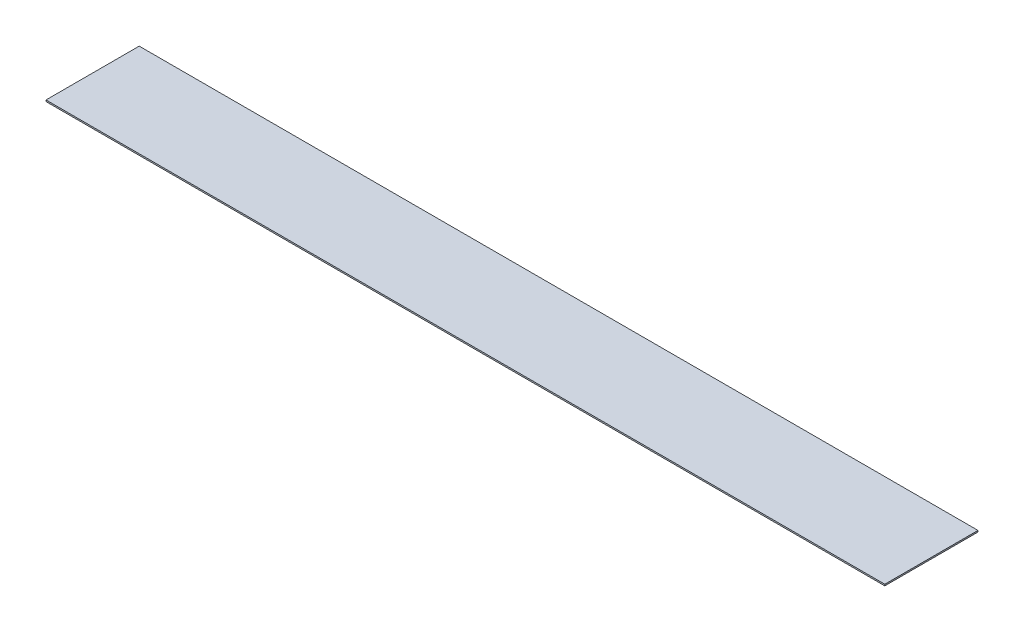
ISO-10303-21;
HEADER;
FILE_DESCRIPTION(('STEP AP214'),'2;1');
FILE_NAME('part.step','',(''),(''),'','','');
FILE_SCHEMA(('AUTOMOTIVE_DESIGN { 1 0 10303 214 1 1 1 1 }'));
ENDSEC;
DATA;
#1=APPLICATION_CONTEXT('core data for automotive mechanical design processes');
#2=APPLICATION_PROTOCOL_DEFINITION('international standard','automotive_design',2000,#1);
#3=PRODUCT_CONTEXT('',#1,'mechanical');
#4=PRODUCT('Part','Part','',(#3));
#5=PRODUCT_RELATED_PRODUCT_CATEGORY('part','',(#4));
#6=PRODUCT_DEFINITION_FORMATION('','',#4);
#7=PRODUCT_DEFINITION_CONTEXT('part definition',#1,'design');
#8=PRODUCT_DEFINITION('design','',#6,#7);
#9=PRODUCT_DEFINITION_SHAPE('','',#8);
#10=(LENGTH_UNIT() NAMED_UNIT(*) SI_UNIT(.MILLI.,.METRE.));
#11=(NAMED_UNIT(*) PLANE_ANGLE_UNIT() SI_UNIT($,.RADIAN.));
#12=(NAMED_UNIT(*) SI_UNIT($,.STERADIAN.) SOLID_ANGLE_UNIT());
#13=UNCERTAINTY_MEASURE_WITH_UNIT(LENGTH_MEASURE(1.E-05),#10,'distance_accuracy_value','');
#14=(GEOMETRIC_REPRESENTATION_CONTEXT(3) GLOBAL_UNCERTAINTY_ASSIGNED_CONTEXT((#13)) GLOBAL_UNIT_ASSIGNED_CONTEXT((#10,
#11,#12)) REPRESENTATION_CONTEXT('',''));
#15=CARTESIAN_POINT('',(0.,0.,0.));
#16=DIRECTION('',(0.,0.,1.));
#17=DIRECTION('',(1.,0.,0.));
#18=AXIS2_PLACEMENT_3D('',#15,#16,#17);
#19=CARTESIAN_POINT('',(0.,1.5875,0.));
#20=DIRECTION('',(1.,0.,0.));
#21=DIRECTION('',(0.,0.,-1.));
#22=AXIS2_PLACEMENT_3D('',#19,#20,#21);
#23=PLANE('',#22);
#24=DIRECTION('',(0.,0.,1.));
#25=VECTOR('',#24,1.);
#26=CARTESIAN_POINT('',(0.,0.,0.));
#27=LINE('',#26,#25);
#28=CARTESIAN_POINT('',(0.,0.,-101.6));
#29=VERTEX_POINT('',#28);
#30=CARTESIAN_POINT('',(0.,0.,0.));
#31=VERTEX_POINT('',#30);
#32=EDGE_CURVE('E96',#29,#31,#27,.T.);
#33=ORIENTED_EDGE('',*,*,#32,.T.);
#34=DIRECTION('',(0.,-1.,0.));
#35=VECTOR('',#34,1.);
#36=CARTESIAN_POINT('',(0.,1.5875,0.));
#37=LINE('',#36,#35);
#38=CARTESIAN_POINT('',(0.,1.5875,0.));
#39=VERTEX_POINT('',#38);
#40=EDGE_CURVE('E11',#39,#31,#37,.T.);
#41=ORIENTED_EDGE('',*,*,#40,.F.);
#42=DIRECTION('',(0.,0.,1.));
#43=VECTOR('',#42,1.);
#44=CARTESIAN_POINT('',(0.,1.5875,0.));
#45=LINE('',#44,#43);
#46=CARTESIAN_POINT('',(0.,1.5875,-101.6));
#47=VERTEX_POINT('',#46);
#48=EDGE_CURVE('E84',#47,#39,#45,.T.);
#49=ORIENTED_EDGE('',*,*,#48,.F.);
#50=DIRECTION('',(0.,-1.,0.));
#51=VECTOR('',#50,1.);
#52=CARTESIAN_POINT('',(0.,1.5875,-101.6));
#53=LINE('',#52,#51);
#54=EDGE_CURVE('E92',#47,#29,#53,.T.);
#55=ORIENTED_EDGE('',*,*,#54,.T.);
#56=EDGE_LOOP('',(#33,#41,#49,#55));
#57=FACE_BOUND('',#56,.T.);
#58=ADVANCED_FACE('F33',(#57),#23,.F.);
#59=CARTESIAN_POINT('',(0.,1.5875,0.));
#60=DIRECTION('',(0.,0.,-1.));
#61=DIRECTION('',(-1.,0.,0.));
#62=AXIS2_PLACEMENT_3D('',#59,#60,#61);
#63=PLANE('',#62);
#64=DIRECTION('',(1.,0.,0.));
#65=VECTOR('',#64,1.);
#66=CARTESIAN_POINT('',(0.,0.,0.));
#67=LINE('',#66,#65);
#68=CARTESIAN_POINT('',(914.4,0.,0.));
#69=VERTEX_POINT('',#68);
#70=EDGE_CURVE('E88',#31,#69,#67,.T.);
#71=ORIENTED_EDGE('',*,*,#70,.T.);
#72=DIRECTION('',(0.,-1.,0.));
#73=VECTOR('',#72,1.);
#74=CARTESIAN_POINT('',(914.4,1.5875,0.));
#75=LINE('',#74,#73);
#76=CARTESIAN_POINT('',(914.4,1.5875,0.));
#77=VERTEX_POINT('',#76);
#78=EDGE_CURVE('E41',#77,#69,#75,.T.);
#79=ORIENTED_EDGE('',*,*,#78,.F.);
#80=DIRECTION('',(1.,0.,0.));
#81=VECTOR('',#80,1.);
#82=CARTESIAN_POINT('',(0.,1.5875,0.));
#83=LINE('',#82,#81);
#84=EDGE_CURVE('E79',#39,#77,#83,.T.);
#85=ORIENTED_EDGE('',*,*,#84,.F.);
#86=ORIENTED_EDGE('',*,*,#40,.T.);
#87=EDGE_LOOP('',(#71,#79,#85,#86));
#88=FACE_BOUND('',#87,.T.);
#89=ADVANCED_FACE('F87',(#88),#63,.F.);
#90=CARTESIAN_POINT('',(914.4,1.5875,0.));
#91=DIRECTION('',(-1.,0.,0.));
#92=DIRECTION('',(0.,0.,1.));
#93=AXIS2_PLACEMENT_3D('',#90,#91,#92);
#94=PLANE('',#93);
#95=DIRECTION('',(0.,0.,-1.));
#96=VECTOR('',#95,1.);
#97=CARTESIAN_POINT('',(914.4,0.,0.));
#98=LINE('',#97,#96);
#99=CARTESIAN_POINT('',(914.4,0.,-101.6));
#100=VERTEX_POINT('',#99);
#101=EDGE_CURVE('E66',#69,#100,#98,.T.);
#102=ORIENTED_EDGE('',*,*,#101,.T.);
#103=DIRECTION('',(0.,-1.,0.));
#104=VECTOR('',#103,1.);
#105=CARTESIAN_POINT('',(914.4,1.5875,-101.6));
#106=LINE('',#105,#104);
#107=CARTESIAN_POINT('',(914.4,1.5875,-101.6));
#108=VERTEX_POINT('',#107);
#109=EDGE_CURVE('E89',#108,#100,#106,.T.);
#110=ORIENTED_EDGE('',*,*,#109,.F.);
#111=DIRECTION('',(0.,0.,-1.));
#112=VECTOR('',#111,1.);
#113=CARTESIAN_POINT('',(914.4,1.5875,0.));
#114=LINE('',#113,#112);
#115=EDGE_CURVE('E82',#77,#108,#114,.T.);
#116=ORIENTED_EDGE('',*,*,#115,.F.);
#117=ORIENTED_EDGE('',*,*,#78,.T.);
#118=EDGE_LOOP('',(#102,#110,#116,#117));
#119=FACE_BOUND('',#118,.T.);
#120=ADVANCED_FACE('F90',(#119),#94,.F.);
#121=CARTESIAN_POINT('',(0.,1.5875,-101.6));
#122=DIRECTION('',(0.,0.,1.));
#123=DIRECTION('',(1.,0.,0.));
#124=AXIS2_PLACEMENT_3D('',#121,#122,#123);
#125=PLANE('',#124);
#126=DIRECTION('',(-1.,0.,0.));
#127=VECTOR('',#126,1.);
#128=CARTESIAN_POINT('',(0.,0.,-101.6));
#129=LINE('',#128,#127);
#130=EDGE_CURVE('E72',#100,#29,#129,.T.);
#131=ORIENTED_EDGE('',*,*,#130,.T.);
#132=ORIENTED_EDGE('',*,*,#54,.F.);
#133=DIRECTION('',(-1.,0.,0.));
#134=VECTOR('',#133,1.);
#135=CARTESIAN_POINT('',(0.,1.5875,-101.6));
#136=LINE('',#135,#134);
#137=EDGE_CURVE('E49',#108,#47,#136,.T.);
#138=ORIENTED_EDGE('',*,*,#137,.F.);
#139=ORIENTED_EDGE('',*,*,#109,.T.);
#140=EDGE_LOOP('',(#131,#132,#138,#139));
#141=FACE_BOUND('',#140,.T.);
#142=ADVANCED_FACE('F103',(#141),#125,.F.);
#143=CARTESIAN_POINT('',(0.,1.5875,0.));
#144=DIRECTION('',(0.,-1.,0.));
#145=DIRECTION('',(0.,0.,-1.));
#146=AXIS2_PLACEMENT_3D('',#143,#144,#145);
#147=PLANE('',#146);
#148=ORIENTED_EDGE('',*,*,#48,.T.);
#149=ORIENTED_EDGE('',*,*,#84,.T.);
#150=ORIENTED_EDGE('',*,*,#115,.T.);
#151=ORIENTED_EDGE('',*,*,#137,.T.);
#152=EDGE_LOOP('',(#148,#149,#150,#151));
#153=FACE_BOUND('',#152,.T.);
#154=ADVANCED_FACE('F80',(#153),#147,.F.);
#155=CARTESIAN_POINT('',(0.,0.,0.));
#156=DIRECTION('',(0.,-1.,0.));
#157=DIRECTION('',(0.,0.,-1.));
#158=AXIS2_PLACEMENT_3D('',#155,#156,#157);
#159=PLANE('',#158);
#160=ORIENTED_EDGE('',*,*,#32,.F.);
#161=ORIENTED_EDGE('',*,*,#130,.F.);
#162=ORIENTED_EDGE('',*,*,#101,.F.);
#163=ORIENTED_EDGE('',*,*,#70,.F.);
#164=EDGE_LOOP('',(#160,#161,#162,#163));
#165=FACE_BOUND('',#164,.T.);
#166=ADVANCED_FACE('F106',(#165),#159,.T.);
#167=CLOSED_SHELL('',(#58,#89,#120,#142,#154,#166));
#168=MANIFOLD_SOLID_BREP('B2',#167);
#169=ADVANCED_BREP_SHAPE_REPRESENTATION('',(#18,#168),#14);
#170=SHAPE_DEFINITION_REPRESENTATION(#9,#169);
ENDSEC;
END-ISO-10303-21;
